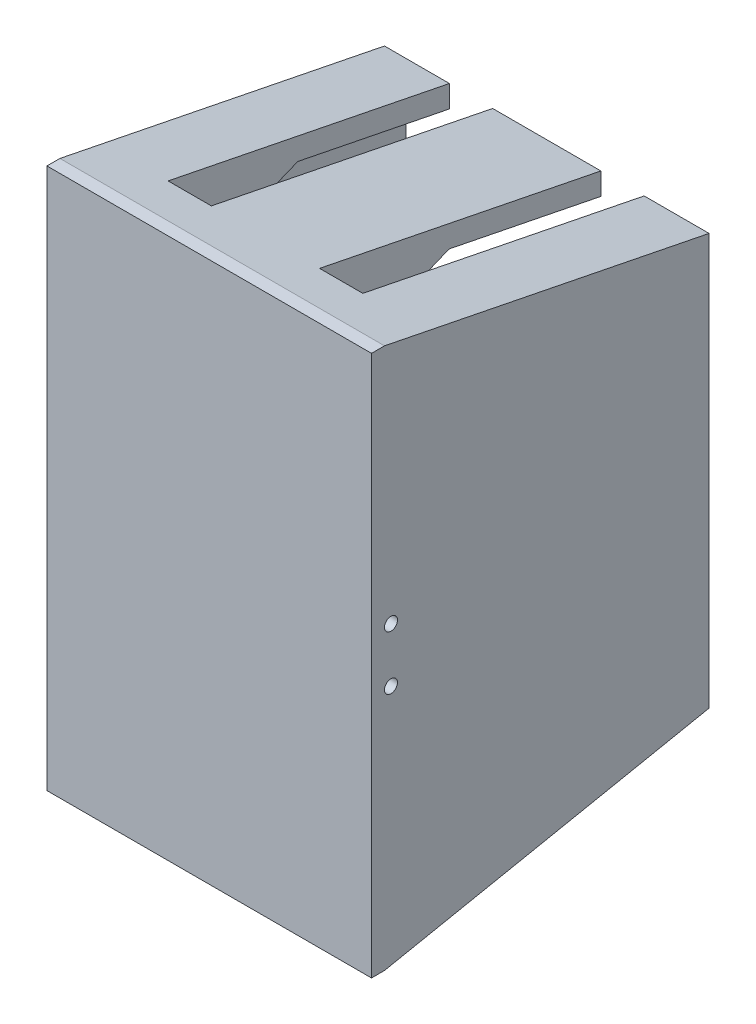
ISO-10303-21;
HEADER;
FILE_DESCRIPTION(('STEP AP214'),'2;1');
FILE_NAME('part.step','',(''),(''),'','','');
FILE_SCHEMA(('AUTOMOTIVE_DESIGN { 1 0 10303 214 1 1 1 1 }'));
ENDSEC;
DATA;
#1=APPLICATION_CONTEXT('core data for automotive mechanical design processes');
#2=APPLICATION_PROTOCOL_DEFINITION('international standard','automotive_design',2000,#1);
#3=PRODUCT_CONTEXT('',#1,'mechanical');
#4=PRODUCT('Part','Part','',(#3));
#5=PRODUCT_RELATED_PRODUCT_CATEGORY('part','',(#4));
#6=PRODUCT_DEFINITION_FORMATION('','',#4);
#7=PRODUCT_DEFINITION_CONTEXT('part definition',#1,'design');
#8=PRODUCT_DEFINITION('design','',#6,#7);
#9=PRODUCT_DEFINITION_SHAPE('','',#8);
#10=(LENGTH_UNIT() NAMED_UNIT(*) SI_UNIT(.MILLI.,.METRE.));
#11=(NAMED_UNIT(*) PLANE_ANGLE_UNIT() SI_UNIT($,.RADIAN.));
#12=(NAMED_UNIT(*) SI_UNIT($,.STERADIAN.) SOLID_ANGLE_UNIT());
#13=UNCERTAINTY_MEASURE_WITH_UNIT(LENGTH_MEASURE(1.E-05),#10,'distance_accuracy_value','');
#14=(GEOMETRIC_REPRESENTATION_CONTEXT(3) GLOBAL_UNCERTAINTY_ASSIGNED_CONTEXT((#13)) GLOBAL_UNIT_ASSIGNED_CONTEXT((#10,
#11,#12)) REPRESENTATION_CONTEXT('',''));
#15=CARTESIAN_POINT('',(0.,0.,0.));
#16=DIRECTION('',(0.,0.,1.));
#17=DIRECTION('',(1.,0.,0.));
#18=AXIS2_PLACEMENT_3D('',#15,#16,#17);
#19=CARTESIAN_POINT('',(37.5,-42.5970966215454,-36.5194193243091));
#20=DIRECTION('',(0.,0.98058067569092,0.196116135138184));
#21=DIRECTION('',(0.,-0.196116135138184,0.98058067569092));
#22=AXIS2_PLACEMENT_3D('',#19,#20,#21);
#23=PLANE('',#22);
#24=DIRECTION('',(0.,0.196116135138184,-0.98058067569092));
#25=VECTOR('',#24,1.);
#26=CARTESIAN_POINT('',(-12.5,-42.5970966215454,-36.5194193243091));
#27=LINE('',#26,#25);
#28=CARTESIAN_POINT('',(-12.5,-49.4009804864072,-2.5));
#29=VERTEX_POINT('',#28);
#30=CARTESIAN_POINT('',(-12.5,-42.4009804864072,-37.5));
#31=VERTEX_POINT('',#30);
#32=EDGE_CURVE('E359',#29,#31,#27,.T.);
#33=ORIENTED_EDGE('',*,*,#32,.F.);
#34=DIRECTION('',(1.,0.,0.));
#35=VECTOR('',#34,1.);
#36=CARTESIAN_POINT('',(-98.8782389027314,-49.4009804864072,-2.5));
#37=LINE('',#36,#35);
#38=CARTESIAN_POINT('',(12.5,-49.4009804864072,-2.5));
#39=VERTEX_POINT('',#38);
#40=EDGE_CURVE('E382',#29,#39,#37,.T.);
#41=ORIENTED_EDGE('',*,*,#40,.T.);
#42=DIRECTION('',(0.,-0.196116135138184,0.98058067569092));
#43=VECTOR('',#42,1.);
#44=CARTESIAN_POINT('',(12.5,-42.5970966215454,-36.5194193243091));
#45=LINE('',#44,#43);
#46=CARTESIAN_POINT('',(12.5,-42.4009804864072,-37.5));
#47=VERTEX_POINT('',#46);
#48=EDGE_CURVE('E333',#47,#39,#45,.T.);
#49=ORIENTED_EDGE('',*,*,#48,.F.);
#50=DIRECTION('',(-1.,0.,0.));
#51=VECTOR('',#50,1.);
#52=CARTESIAN_POINT('',(37.5,-42.4009804864072,-37.5));
#53=LINE('',#52,#51);
#54=EDGE_CURVE('E407',#47,#31,#53,.T.);
#55=ORIENTED_EDGE('',*,*,#54,.T.);
#56=EDGE_LOOP('',(#33,#41,#49,#55));
#57=FACE_BOUND('',#56,.T.);
#58=ADVANCED_FACE('F57',(#57),#23,.T.);
#59=DIRECTION('',(0.,-0.196116135138184,0.98058067569092));
#60=VECTOR('',#59,1.);
#61=CARTESIAN_POINT('',(-22.5,-42.5970966215454,-36.5194193243091));
#62=LINE('',#61,#60);
#63=CARTESIAN_POINT('',(-22.5,-42.4009804864072,-37.5));
#64=VERTEX_POINT('',#63);
#65=CARTESIAN_POINT('',(-22.5,-49.4009804864072,-2.5));
#66=VERTEX_POINT('',#65);
#67=EDGE_CURVE('E343',#64,#66,#62,.T.);
#68=ORIENTED_EDGE('',*,*,#67,.F.);
#69=CARTESIAN_POINT('',(-32.5,-42.4009804864072,-37.5));
#70=VERTEX_POINT('',#69);
#71=EDGE_CURVE('E395',#64,#70,#53,.T.);
#72=ORIENTED_EDGE('',*,*,#71,.T.);
#73=DIRECTION('',(0.,0.196116135138184,-0.98058067569092));
#74=VECTOR('',#73,1.);
#75=CARTESIAN_POINT('',(-32.5,-47.9817120061608,-9.59634240123216));
#76=LINE('',#75,#74);
#77=CARTESIAN_POINT('',(-32.5,-49.4009804864072,-2.50000000000001));
#78=VERTEX_POINT('',#77);
#79=EDGE_CURVE('E385',#78,#70,#76,.T.);
#80=ORIENTED_EDGE('',*,*,#79,.F.);
#81=EDGE_CURVE('E379',#78,#66,#37,.T.);
#82=ORIENTED_EDGE('',*,*,#81,.T.);
#83=EDGE_LOOP('',(#68,#72,#80,#82));
#84=FACE_BOUND('',#83,.T.);
#85=ADVANCED_FACE('F584',(#84),#23,.T.);
#86=CARTESIAN_POINT('',(37.5,-37.5,-37.5));
#87=DIRECTION('',(0.,0.,1.));
#88=DIRECTION('',(0.,-1.,0.));
#89=AXIS2_PLACEMENT_3D('',#86,#87,#88);
#90=PLANE('',#89);
#91=DIRECTION('',(-1.,0.,0.));
#92=VECTOR('',#91,1.);
#93=CARTESIAN_POINT('',(37.5,42.4009804864072,-37.5000000000001));
#94=LINE('',#93,#92);
#95=CARTESIAN_POINT('',(12.5,42.4009804864072,-37.5));
#96=VERTEX_POINT('',#95);
#97=CARTESIAN_POINT('',(-12.5,42.4009804864072,-37.5));
#98=VERTEX_POINT('',#97);
#99=EDGE_CURVE('E400',#96,#98,#94,.T.);
#100=ORIENTED_EDGE('',*,*,#99,.T.);
#101=DIRECTION('',(0.,1.,0.));
#102=VECTOR('',#101,1.);
#103=CARTESIAN_POINT('',(-12.5,-62.5,-37.5));
#104=LINE('',#103,#102);
#105=CARTESIAN_POINT('',(-12.5,47.5,-37.5));
#106=VERTEX_POINT('',#105);
#107=EDGE_CURVE('E301',#98,#106,#104,.T.);
#108=ORIENTED_EDGE('',*,*,#107,.T.);
#109=DIRECTION('',(-1.,0.,0.));
#110=VECTOR('',#109,1.);
#111=CARTESIAN_POINT('',(37.5,47.5,-37.5));
#112=LINE('',#111,#110);
#113=CARTESIAN_POINT('',(12.5,47.5,-37.5));
#114=VERTEX_POINT('',#113);
#115=EDGE_CURVE('E437',#114,#106,#112,.T.);
#116=ORIENTED_EDGE('',*,*,#115,.F.);
#117=DIRECTION('',(0.,1.,0.));
#118=VECTOR('',#117,1.);
#119=CARTESIAN_POINT('',(12.5,-62.5,-37.5));
#120=LINE('',#119,#118);
#121=EDGE_CURVE('E305',#96,#114,#120,.T.);
#122=ORIENTED_EDGE('',*,*,#121,.F.);
#123=EDGE_LOOP('',(#100,#108,#116,#122));
#124=FACE_BOUND('',#123,.T.);
#125=ADVANCED_FACE('F589',(#124),#90,.F.);
#126=DIRECTION('',(-1.,0.,0.));
#127=VECTOR('',#126,1.);
#128=CARTESIAN_POINT('',(37.5,-47.5,-37.5));
#129=LINE('',#128,#127);
#130=CARTESIAN_POINT('',(12.5,-47.5,-37.5));
#131=VERTEX_POINT('',#130);
#132=CARTESIAN_POINT('',(-12.5,-47.5,-37.5));
#133=VERTEX_POINT('',#132);
#134=EDGE_CURVE('E427',#131,#133,#129,.T.);
#135=ORIENTED_EDGE('',*,*,#134,.T.);
#136=EDGE_CURVE('E300',#133,#31,#104,.T.);
#137=ORIENTED_EDGE('',*,*,#136,.T.);
#138=ORIENTED_EDGE('',*,*,#54,.F.);
#139=EDGE_CURVE('E304',#131,#47,#120,.T.);
#140=ORIENTED_EDGE('',*,*,#139,.F.);
#141=EDGE_LOOP('',(#135,#137,#138,#140));
#142=FACE_BOUND('',#141,.T.);
#143=ADVANCED_FACE('F482',(#142),#90,.F.);
#144=CARTESIAN_POINT('',(-22.5,47.5,-37.5));
#145=VERTEX_POINT('',#144);
#146=CARTESIAN_POINT('',(-37.5,47.5,-37.5));
#147=VERTEX_POINT('',#146);
#148=EDGE_CURVE('E432',#145,#147,#112,.T.);
#149=ORIENTED_EDGE('',*,*,#148,.F.);
#150=DIRECTION('',(0.,1.,0.));
#151=VECTOR('',#150,1.);
#152=CARTESIAN_POINT('',(-22.5,-62.5,-37.5));
#153=LINE('',#152,#151);
#154=CARTESIAN_POINT('',(-22.5,42.4009804864072,-37.5));
#155=VERTEX_POINT('',#154);
#156=EDGE_CURVE('E298',#155,#145,#153,.T.);
#157=ORIENTED_EDGE('',*,*,#156,.F.);
#158=CARTESIAN_POINT('',(-32.5,42.4009804864072,-37.5000000000001));
#159=VERTEX_POINT('',#158);
#160=EDGE_CURVE('E401',#155,#159,#94,.T.);
#161=ORIENTED_EDGE('',*,*,#160,.T.);
#162=DIRECTION('',(0.,1.,0.));
#163=VECTOR('',#162,1.);
#164=CARTESIAN_POINT('',(-32.5,0.,-37.5));
#165=LINE('',#164,#163);
#166=EDGE_CURVE('E393',#70,#159,#165,.T.);
#167=ORIENTED_EDGE('',*,*,#166,.F.);
#168=ORIENTED_EDGE('',*,*,#71,.F.);
#169=CARTESIAN_POINT('',(-22.5,-47.5,-37.5));
#170=VERTEX_POINT('',#169);
#171=EDGE_CURVE('E297',#170,#64,#153,.T.);
#172=ORIENTED_EDGE('',*,*,#171,.F.);
#173=CARTESIAN_POINT('',(-37.5,-47.5,-37.5));
#174=VERTEX_POINT('',#173);
#175=EDGE_CURVE('E418',#170,#174,#129,.T.);
#176=ORIENTED_EDGE('',*,*,#175,.T.);
#177=DIRECTION('',(0.,1.,0.));
#178=VECTOR('',#177,1.);
#179=CARTESIAN_POINT('',(-37.5,-37.5,-37.5));
#180=LINE('',#179,#178);
#181=EDGE_CURVE('E413',#174,#147,#180,.T.);
#182=ORIENTED_EDGE('',*,*,#181,.T.);
#183=EDGE_LOOP('',(#149,#157,#161,#167,#168,#172,#176,#182));
#184=FACE_BOUND('',#183,.T.);
#185=ADVANCED_FACE('F489',(#184),#90,.F.);
#186=CARTESIAN_POINT('',(37.5,42.5970966215454,-36.5194193243091));
#187=DIRECTION('',(0.,-0.98058067569092,0.196116135138184));
#188=DIRECTION('',(0.,-0.196116135138184,-0.98058067569092));
#189=AXIS2_PLACEMENT_3D('',#186,#187,#188);
#190=PLANE('',#189);
#191=DIRECTION('',(0.,0.196116135138184,0.98058067569092));
#192=VECTOR('',#191,1.);
#193=CARTESIAN_POINT('',(-12.5,42.5970966215454,-36.5194193243091));
#194=LINE('',#193,#192);
#195=CARTESIAN_POINT('',(-12.5,49.4009804864072,-2.5));
#196=VERTEX_POINT('',#195);
#197=EDGE_CURVE('E357',#98,#196,#194,.T.);
#198=ORIENTED_EDGE('',*,*,#197,.F.);
#199=ORIENTED_EDGE('',*,*,#99,.F.);
#200=DIRECTION('',(0.,-0.196116135138184,-0.98058067569092));
#201=VECTOR('',#200,1.);
#202=CARTESIAN_POINT('',(12.5,42.5970966215454,-36.5194193243091));
#203=LINE('',#202,#201);
#204=CARTESIAN_POINT('',(12.5,49.4009804864072,-2.5));
#205=VERTEX_POINT('',#204);
#206=EDGE_CURVE('E331',#205,#96,#203,.T.);
#207=ORIENTED_EDGE('',*,*,#206,.F.);
#208=DIRECTION('',(1.,0.,0.));
#209=VECTOR('',#208,1.);
#210=CARTESIAN_POINT('',(-98.8782389027314,49.4009804864072,-2.5));
#211=LINE('',#210,#209);
#212=EDGE_CURVE('E372',#196,#205,#211,.T.);
#213=ORIENTED_EDGE('',*,*,#212,.F.);
#214=EDGE_LOOP('',(#198,#199,#207,#213));
#215=FACE_BOUND('',#214,.T.);
#216=ADVANCED_FACE('F600',(#215),#190,.T.);
#217=DIRECTION('',(0.,-0.196116135138184,-0.98058067569092));
#218=VECTOR('',#217,1.);
#219=CARTESIAN_POINT('',(-22.5,42.5970966215454,-36.5194193243091));
#220=LINE('',#219,#218);
#221=CARTESIAN_POINT('',(-22.5,49.4009804864072,-2.5));
#222=VERTEX_POINT('',#221);
#223=EDGE_CURVE('E341',#222,#155,#220,.T.);
#224=ORIENTED_EDGE('',*,*,#223,.F.);
#225=CARTESIAN_POINT('',(-32.5,49.4009804864072,-2.5));
#226=VERTEX_POINT('',#225);
#227=EDGE_CURVE('E368',#226,#222,#211,.T.);
#228=ORIENTED_EDGE('',*,*,#227,.F.);
#229=DIRECTION('',(0.,0.196116135138184,0.98058067569092));
#230=VECTOR('',#229,1.);
#231=CARTESIAN_POINT('',(-32.5,47.9817120061608,-9.59634240123216));
#232=LINE('',#231,#230);
#233=EDGE_CURVE('E378',#159,#226,#232,.T.);
#234=ORIENTED_EDGE('',*,*,#233,.F.);
#235=ORIENTED_EDGE('',*,*,#160,.F.);
#236=EDGE_LOOP('',(#224,#228,#234,#235));
#237=FACE_BOUND('',#236,.T.);
#238=ADVANCED_FACE('F594',(#237),#190,.T.);
#239=DIRECTION('',(0.,0.196116135138184,-0.98058067569092));
#240=VECTOR('',#239,1.);
#241=CARTESIAN_POINT('',(22.5,-42.5970966215454,-36.5194193243091));
#242=LINE('',#241,#240);
#243=CARTESIAN_POINT('',(22.5,-49.4009804864072,-2.5));
#244=VERTEX_POINT('',#243);
#245=CARTESIAN_POINT('',(22.5,-42.4009804864072,-37.5));
#246=VERTEX_POINT('',#245);
#247=EDGE_CURVE('E323',#244,#246,#242,.T.);
#248=ORIENTED_EDGE('',*,*,#247,.F.);
#249=CARTESIAN_POINT('',(32.5,-49.4009804864072,-2.50000000000001));
#250=VERTEX_POINT('',#249);
#251=EDGE_CURVE('E375',#244,#250,#37,.T.);
#252=ORIENTED_EDGE('',*,*,#251,.T.);
#253=DIRECTION('',(0.,0.196116135138184,-0.98058067569092));
#254=VECTOR('',#253,1.);
#255=CARTESIAN_POINT('',(32.5,-47.9817120061608,-9.59634240123216));
#256=LINE('',#255,#254);
#257=CARTESIAN_POINT('',(32.5,-42.4009804864072,-37.5));
#258=VERTEX_POINT('',#257);
#259=EDGE_CURVE('E389',#250,#258,#256,.T.);
#260=ORIENTED_EDGE('',*,*,#259,.T.);
#261=EDGE_CURVE('E404',#258,#246,#53,.T.);
#262=ORIENTED_EDGE('',*,*,#261,.T.);
#263=EDGE_LOOP('',(#248,#252,#260,#262));
#264=FACE_BOUND('',#263,.T.);
#265=ADVANCED_FACE('F561',(#264),#23,.T.);
#266=CARTESIAN_POINT('',(32.5,0.,0.));
#267=DIRECTION('',(-1.,0.,0.));
#268=DIRECTION('',(0.,0.,1.));
#269=AXIS2_PLACEMENT_3D('',#266,#267,#268);
#270=PLANE('',#269);
#271=CARTESIAN_POINT('',(32.5,0.,-19.8636696145484));
#272=DIRECTION('',(-1.,0.,0.));
#273=DIRECTION('',(0.,0.,1.));
#274=AXIS2_PLACEMENT_3D('',#271,#272,#273);
#275=CIRCLE('',#274,52.3636696145484);
#276=CARTESIAN_POINT('',(32.5,49.4009804864072,-2.5));
#277=VERTEX_POINT('',#276);
#278=EDGE_CURVE('E371',#277,#250,#275,.F.);
#279=ORIENTED_EDGE('',*,*,#278,.F.);
#280=DIRECTION('',(0.,0.196116135138184,0.98058067569092));
#281=VECTOR('',#280,1.);
#282=CARTESIAN_POINT('',(32.5,47.9817120061608,-9.59634240123216));
#283=LINE('',#282,#281);
#284=CARTESIAN_POINT('',(32.5,42.4009804864072,-37.5000000000001));
#285=VERTEX_POINT('',#284);
#286=EDGE_CURVE('E386',#285,#277,#283,.T.);
#287=ORIENTED_EDGE('',*,*,#286,.F.);
#288=DIRECTION('',(0.,1.,0.));
#289=VECTOR('',#288,1.);
#290=CARTESIAN_POINT('',(32.5,0.,-37.5));
#291=LINE('',#290,#289);
#292=EDGE_CURVE('E390',#258,#285,#291,.T.);
#293=ORIENTED_EDGE('',*,*,#292,.F.);
#294=ORIENTED_EDGE('',*,*,#259,.F.);
#295=EDGE_LOOP('',(#279,#287,#293,#294));
#296=FACE_BOUND('',#295,.T.);
#297=ADVANCED_FACE('F554',(#296),#270,.T.);
#298=CARTESIAN_POINT('',(-32.5,0.,0.));
#299=DIRECTION('',(-1.,0.,0.));
#300=DIRECTION('',(0.,0.,1.));
#301=AXIS2_PLACEMENT_3D('',#298,#299,#300);
#302=PLANE('',#301);
#303=ORIENTED_EDGE('',*,*,#233,.T.);
#304=CARTESIAN_POINT('',(-32.5,0.,-19.8636696145484));
#305=DIRECTION('',(-1.,0.,0.));
#306=DIRECTION('',(0.,0.,1.));
#307=AXIS2_PLACEMENT_3D('',#304,#305,#306);
#308=CIRCLE('',#307,52.3636696145484);
#309=EDGE_CURVE('E376',#226,#78,#308,.F.);
#310=ORIENTED_EDGE('',*,*,#309,.T.);
#311=ORIENTED_EDGE('',*,*,#79,.T.);
#312=ORIENTED_EDGE('',*,*,#166,.T.);
#313=EDGE_LOOP('',(#303,#310,#311,#312));
#314=FACE_BOUND('',#313,.T.);
#315=ADVANCED_FACE('F599',(#314),#302,.F.);
#316=CARTESIAN_POINT('',(37.5,-47.5,-37.5));
#317=VERTEX_POINT('',#316);
#318=CARTESIAN_POINT('',(22.5,-47.5,-37.5));
#319=VERTEX_POINT('',#318);
#320=EDGE_CURVE('E423',#317,#319,#129,.T.);
#321=ORIENTED_EDGE('',*,*,#320,.T.);
#322=DIRECTION('',(0.,1.,0.));
#323=VECTOR('',#322,1.);
#324=CARTESIAN_POINT('',(22.5,-62.5,-37.5));
#325=LINE('',#324,#323);
#326=EDGE_CURVE('E307',#319,#246,#325,.T.);
#327=ORIENTED_EDGE('',*,*,#326,.T.);
#328=ORIENTED_EDGE('',*,*,#261,.F.);
#329=ORIENTED_EDGE('',*,*,#292,.T.);
#330=CARTESIAN_POINT('',(22.5,42.4009804864072,-37.5));
#331=VERTEX_POINT('',#330);
#332=EDGE_CURVE('E396',#285,#331,#94,.T.);
#333=ORIENTED_EDGE('',*,*,#332,.T.);
#334=CARTESIAN_POINT('',(22.5,47.5,-37.5));
#335=VERTEX_POINT('',#334);
#336=EDGE_CURVE('E308',#331,#335,#325,.T.);
#337=ORIENTED_EDGE('',*,*,#336,.T.);
#338=CARTESIAN_POINT('',(37.5,47.5,-37.5));
#339=VERTEX_POINT('',#338);
#340=EDGE_CURVE('E433',#339,#335,#112,.T.);
#341=ORIENTED_EDGE('',*,*,#340,.F.);
#342=DIRECTION('',(0.,1.,0.));
#343=VECTOR('',#342,1.);
#344=CARTESIAN_POINT('',(37.5,-32.5,-37.5));
#345=LINE('',#344,#343);
#346=EDGE_CURVE('E410',#317,#339,#345,.T.);
#347=ORIENTED_EDGE('',*,*,#346,.F.);
#348=EDGE_LOOP('',(#321,#327,#328,#329,#333,#337,#341,#347));
#349=FACE_BOUND('',#348,.T.);
#350=ADVANCED_FACE('F534',(#349),#90,.F.);
#351=CARTESIAN_POINT('',(37.5,47.5,-37.5));
#352=DIRECTION('',(0.,-0.98058067569092,0.196116135138184));
#353=DIRECTION('',(0.,-0.196116135138184,-0.98058067569092));
#354=AXIS2_PLACEMENT_3D('',#351,#352,#353);
#355=PLANE('',#354);
#356=ORIENTED_EDGE('',*,*,#115,.T.);
#357=DIRECTION('',(0.,0.196116135138184,0.98058067569092));
#358=VECTOR('',#357,1.);
#359=CARTESIAN_POINT('',(-12.5,47.5,-37.5));
#360=LINE('',#359,#358);
#361=CARTESIAN_POINT('',(-12.5,60.5,27.5));
#362=VERTEX_POINT('',#361);
#363=EDGE_CURVE('E364',#106,#362,#360,.T.);
#364=ORIENTED_EDGE('',*,*,#363,.T.);
#365=DIRECTION('',(-1.,0.,0.));
#366=VECTOR('',#365,1.);
#367=CARTESIAN_POINT('',(37.5,60.5,27.5));
#368=LINE('',#367,#366);
#369=CARTESIAN_POINT('',(-22.5,60.5,27.5));
#370=VERTEX_POINT('',#369);
#371=EDGE_CURVE('E354',#362,#370,#368,.T.);
#372=ORIENTED_EDGE('',*,*,#371,.T.);
#373=DIRECTION('',(0.,-0.196116135138184,-0.98058067569092));
#374=VECTOR('',#373,1.);
#375=CARTESIAN_POINT('',(-22.5,47.5,-37.5));
#376=LINE('',#375,#374);
#377=EDGE_CURVE('E348',#370,#145,#376,.T.);
#378=ORIENTED_EDGE('',*,*,#377,.T.);
#379=ORIENTED_EDGE('',*,*,#148,.T.);
#380=DIRECTION('',(0.,0.196116135138184,0.98058067569092));
#381=VECTOR('',#380,1.);
#382=CARTESIAN_POINT('',(-37.5,47.5,-37.5));
#383=LINE('',#382,#381);
#384=CARTESIAN_POINT('',(-37.5,62.5,37.5));
#385=VERTEX_POINT('',#384);
#386=EDGE_CURVE('E399',#147,#385,#383,.T.);
#387=ORIENTED_EDGE('',*,*,#386,.T.);
#388=DIRECTION('',(-1.,0.,0.));
#389=VECTOR('',#388,1.);
#390=CARTESIAN_POINT('',(37.5,62.5,37.5));
#391=LINE('',#390,#389);
#392=CARTESIAN_POINT('',(37.5,62.5,37.5));
#393=VERTEX_POINT('',#392);
#394=EDGE_CURVE('E429',#393,#385,#391,.T.);
#395=ORIENTED_EDGE('',*,*,#394,.F.);
#396=DIRECTION('',(0.,0.196116135138184,0.98058067569092));
#397=VECTOR('',#396,1.);
#398=CARTESIAN_POINT('',(37.5,47.5,-37.5));
#399=LINE('',#398,#397);
#400=EDGE_CURVE('E412',#339,#393,#399,.T.);
#401=ORIENTED_EDGE('',*,*,#400,.F.);
#402=ORIENTED_EDGE('',*,*,#340,.T.);
#403=DIRECTION('',(0.,0.196116135138184,0.98058067569092));
#404=VECTOR('',#403,1.);
#405=CARTESIAN_POINT('',(22.5,47.5,-37.5));
#406=LINE('',#405,#404);
#407=CARTESIAN_POINT('',(22.5,60.5,27.5));
#408=VERTEX_POINT('',#407);
#409=EDGE_CURVE('E328',#335,#408,#406,.T.);
#410=ORIENTED_EDGE('',*,*,#409,.T.);
#411=DIRECTION('',(-1.,0.,0.));
#412=VECTOR('',#411,1.);
#413=CARTESIAN_POINT('',(37.5,60.5,27.5));
#414=LINE('',#413,#412);
#415=CARTESIAN_POINT('',(12.5,60.5,27.5));
#416=VERTEX_POINT('',#415);
#417=EDGE_CURVE('E318',#408,#416,#414,.T.);
#418=ORIENTED_EDGE('',*,*,#417,.T.);
#419=DIRECTION('',(0.,-0.196116135138184,-0.98058067569092));
#420=VECTOR('',#419,1.);
#421=CARTESIAN_POINT('',(12.5,47.5,-37.5));
#422=LINE('',#421,#420);
#423=EDGE_CURVE('E338',#416,#114,#422,.T.);
#424=ORIENTED_EDGE('',*,*,#423,.T.);
#425=EDGE_LOOP('',(#356,#364,#372,#378,#379,#387,#395,#401,#402,#410,#418,#424));
#426=FACE_BOUND('',#425,.T.);
#427=ADVANCED_FACE('F59',(#426),#355,.F.);
#428=CARTESIAN_POINT('',(37.5,-47.5,-37.5));
#429=DIRECTION('',(0.,0.98058067569092,0.196116135138184));
#430=DIRECTION('',(0.,-0.196116135138184,0.98058067569092));
#431=AXIS2_PLACEMENT_3D('',#428,#429,#430);
#432=PLANE('',#431);
#433=DIRECTION('',(1.,0.,0.));
#434=VECTOR('',#433,1.);
#435=CARTESIAN_POINT('',(37.5,-60.5,27.5));
#436=LINE('',#435,#434);
#437=CARTESIAN_POINT('',(-22.5,-60.5,27.5));
#438=VERTEX_POINT('',#437);
#439=CARTESIAN_POINT('',(-12.5,-60.5,27.5));
#440=VERTEX_POINT('',#439);
#441=EDGE_CURVE('E351',#438,#440,#436,.T.);
#442=ORIENTED_EDGE('',*,*,#441,.T.);
#443=DIRECTION('',(0.,0.196116135138184,-0.98058067569092));
#444=VECTOR('',#443,1.);
#445=CARTESIAN_POINT('',(-12.5,-47.5,-37.5));
#446=LINE('',#445,#444);
#447=EDGE_CURVE('E361',#440,#133,#446,.T.);
#448=ORIENTED_EDGE('',*,*,#447,.T.);
#449=ORIENTED_EDGE('',*,*,#134,.F.);
#450=DIRECTION('',(0.,-0.196116135138184,0.98058067569092));
#451=VECTOR('',#450,1.);
#452=CARTESIAN_POINT('',(12.5,-47.5,-37.5));
#453=LINE('',#452,#451);
#454=CARTESIAN_POINT('',(12.5,-60.5,27.5));
#455=VERTEX_POINT('',#454);
#456=EDGE_CURVE('E335',#131,#455,#453,.T.);
#457=ORIENTED_EDGE('',*,*,#456,.T.);
#458=DIRECTION('',(1.,0.,0.));
#459=VECTOR('',#458,1.);
#460=CARTESIAN_POINT('',(37.5,-60.5,27.5));
#461=LINE('',#460,#459);
#462=CARTESIAN_POINT('',(22.5,-60.5,27.5));
#463=VERTEX_POINT('',#462);
#464=EDGE_CURVE('E315',#455,#463,#461,.T.);
#465=ORIENTED_EDGE('',*,*,#464,.T.);
#466=DIRECTION('',(0.,0.196116135138184,-0.98058067569092));
#467=VECTOR('',#466,1.);
#468=CARTESIAN_POINT('',(22.5,-47.5,-37.5));
#469=LINE('',#468,#467);
#470=EDGE_CURVE('E325',#463,#319,#469,.T.);
#471=ORIENTED_EDGE('',*,*,#470,.T.);
#472=ORIENTED_EDGE('',*,*,#320,.F.);
#473=DIRECTION('',(0.,0.196116135138184,-0.98058067569092));
#474=VECTOR('',#473,1.);
#475=CARTESIAN_POINT('',(37.5,-47.5,-37.5));
#476=LINE('',#475,#474);
#477=CARTESIAN_POINT('',(37.5,-62.5,37.5));
#478=VERTEX_POINT('',#477);
#479=EDGE_CURVE('E415',#478,#317,#476,.T.);
#480=ORIENTED_EDGE('',*,*,#479,.F.);
#481=DIRECTION('',(-1.,0.,0.));
#482=VECTOR('',#481,1.);
#483=CARTESIAN_POINT('',(37.5,-62.5,37.5));
#484=LINE('',#483,#482);
#485=CARTESIAN_POINT('',(-37.5,-62.5,37.5));
#486=VERTEX_POINT('',#485);
#487=EDGE_CURVE('E426',#478,#486,#484,.T.);
#488=ORIENTED_EDGE('',*,*,#487,.T.);
#489=DIRECTION('',(0.,0.196116135138184,-0.98058067569092));
#490=VECTOR('',#489,1.);
#491=CARTESIAN_POINT('',(-37.5,-47.5,-37.5));
#492=LINE('',#491,#490);
#493=EDGE_CURVE('E282',#486,#174,#492,.T.);
#494=ORIENTED_EDGE('',*,*,#493,.T.);
#495=ORIENTED_EDGE('',*,*,#175,.F.);
#496=DIRECTION('',(0.,-0.196116135138184,0.98058067569092));
#497=VECTOR('',#496,1.);
#498=CARTESIAN_POINT('',(-22.5,-47.5,-37.5));
#499=LINE('',#498,#497);
#500=EDGE_CURVE('E345',#170,#438,#499,.T.);
#501=ORIENTED_EDGE('',*,*,#500,.T.);
#502=EDGE_LOOP('',(#442,#448,#449,#457,#465,#471,#472,#480,#488,#494,#495,#501));
#503=FACE_BOUND('',#502,.T.);
#504=ADVANCED_FACE('F479',(#503),#432,.F.);
#505=CARTESIAN_POINT('',(37.5,0.,0.));
#506=DIRECTION('',(-1.,0.,0.));
#507=DIRECTION('',(0.,0.,1.));
#508=AXIS2_PLACEMENT_3D('',#505,#506,#507);
#509=PLANE('',#508);
#510=CARTESIAN_POINT('',(37.5,6.15,36.));
#511=DIRECTION('',(1.,0.,0.));
#512=DIRECTION('',(0.,0.,-1.));
#513=AXIS2_PLACEMENT_3D('',#510,#511,#512);
#514=CIRCLE('',#513,1.5);
#515=CARTESIAN_POINT('',(37.5,6.15,34.5));
#516=VERTEX_POINT('',#515);
#517=EDGE_CURVE('E511',#516,#516,#514,.T.);
#518=ORIENTED_EDGE('',*,*,#517,.F.);
#519=EDGE_LOOP('',(#518));
#520=FACE_BOUND('',#519,.T.);
#521=CARTESIAN_POINT('',(37.5,-6.35,36.));
#522=DIRECTION('',(1.,0.,0.));
#523=DIRECTION('',(0.,0.,1.));
#524=AXIS2_PLACEMENT_3D('',#521,#522,#523);
#525=CIRCLE('',#524,1.5);
#526=CARTESIAN_POINT('',(37.5,-6.35,37.5));
#527=VERTEX_POINT('',#526);
#528=EDGE_CURVE('E505',#527,#527,#525,.T.);
#529=ORIENTED_EDGE('',*,*,#528,.F.);
#530=EDGE_LOOP('',(#529));
#531=FACE_BOUND('',#530,.T.);
#532=ORIENTED_EDGE('',*,*,#346,.T.);
#533=ORIENTED_EDGE('',*,*,#400,.T.);
#534=DIRECTION('',(0.,0.,-1.));
#535=VECTOR('',#534,1.);
#536=CARTESIAN_POINT('',(37.5,62.5,40.5));
#537=LINE('',#536,#535);
#538=CARTESIAN_POINT('',(37.5,62.5,40.5));
#539=VERTEX_POINT('',#538);
#540=EDGE_CURVE('E287',#539,#393,#537,.T.);
#541=ORIENTED_EDGE('',*,*,#540,.F.);
#542=DIRECTION('',(0.,1.,0.));
#543=VECTOR('',#542,1.);
#544=CARTESIAN_POINT('',(37.5,62.5,40.5));
#545=LINE('',#544,#543);
#546=CARTESIAN_POINT('',(37.5,-62.5,40.5));
#547=VERTEX_POINT('',#546);
#548=EDGE_CURVE('E265',#547,#539,#545,.T.);
#549=ORIENTED_EDGE('',*,*,#548,.F.);
#550=DIRECTION('',(0.,0.,-1.));
#551=VECTOR('',#550,1.);
#552=CARTESIAN_POINT('',(37.5,-62.5,40.5));
#553=LINE('',#552,#551);
#554=EDGE_CURVE('E262',#547,#478,#553,.T.);
#555=ORIENTED_EDGE('',*,*,#554,.T.);
#556=ORIENTED_EDGE('',*,*,#479,.T.);
#557=EDGE_LOOP('',(#532,#533,#541,#549,#555,#556));
#558=FACE_BOUND('',#557,.T.);
#559=ADVANCED_FACE('F526',(#520,#531,#558),#509,.F.);
#560=CARTESIAN_POINT('',(-37.5,0.,0.));
#561=DIRECTION('',(-1.,0.,0.));
#562=DIRECTION('',(0.,0.,1.));
#563=AXIS2_PLACEMENT_3D('',#560,#561,#562);
#564=PLANE('',#563);
#565=CARTESIAN_POINT('',(-37.5,6.15,36.));
#566=DIRECTION('',(1.,0.,0.));
#567=DIRECTION('',(0.,0.,-1.));
#568=AXIS2_PLACEMENT_3D('',#565,#566,#567);
#569=CIRCLE('',#568,1.5);
#570=CARTESIAN_POINT('',(-37.5,6.15,34.5));
#571=VERTEX_POINT('',#570);
#572=EDGE_CURVE('E275',#571,#571,#569,.T.);
#573=ORIENTED_EDGE('',*,*,#572,.T.);
#574=EDGE_LOOP('',(#573));
#575=FACE_BOUND('',#574,.T.);
#576=CARTESIAN_POINT('',(-37.5,-6.35,36.));
#577=DIRECTION('',(1.,0.,0.));
#578=DIRECTION('',(0.,0.,1.));
#579=AXIS2_PLACEMENT_3D('',#576,#577,#578);
#580=CIRCLE('',#579,1.5);
#581=CARTESIAN_POINT('',(-37.5,-6.35,37.5));
#582=VERTEX_POINT('',#581);
#583=EDGE_CURVE('E508',#582,#582,#580,.T.);
#584=ORIENTED_EDGE('',*,*,#583,.T.);
#585=EDGE_LOOP('',(#584));
#586=FACE_BOUND('',#585,.T.);
#587=ORIENTED_EDGE('',*,*,#386,.F.);
#588=ORIENTED_EDGE('',*,*,#181,.F.);
#589=ORIENTED_EDGE('',*,*,#493,.F.);
#590=DIRECTION('',(0.,0.,-1.));
#591=VECTOR('',#590,1.);
#592=CARTESIAN_POINT('',(-37.5,-62.5,40.5));
#593=LINE('',#592,#591);
#594=CARTESIAN_POINT('',(-37.5,-62.5,40.5));
#595=VERTEX_POINT('',#594);
#596=EDGE_CURVE('E260',#595,#486,#593,.T.);
#597=ORIENTED_EDGE('',*,*,#596,.F.);
#598=DIRECTION('',(0.,-1.,0.));
#599=VECTOR('',#598,1.);
#600=CARTESIAN_POINT('',(-37.5,62.5,40.5));
#601=LINE('',#600,#599);
#602=CARTESIAN_POINT('',(-37.5,62.5,40.5));
#603=VERTEX_POINT('',#602);
#604=EDGE_CURVE('E266',#603,#595,#601,.T.);
#605=ORIENTED_EDGE('',*,*,#604,.F.);
#606=DIRECTION('',(0.,0.,-1.));
#607=VECTOR('',#606,1.);
#608=CARTESIAN_POINT('',(-37.5,62.5,40.5));
#609=LINE('',#608,#607);
#610=EDGE_CURVE('E491',#603,#385,#609,.T.);
#611=ORIENTED_EDGE('',*,*,#610,.T.);
#612=EDGE_LOOP('',(#587,#588,#589,#597,#605,#611));
#613=FACE_BOUND('',#612,.T.);
#614=ADVANCED_FACE('F279',(#575,#586,#613),#564,.T.);
#615=DIRECTION('',(0.,0.196116135138184,0.98058067569092));
#616=VECTOR('',#615,1.);
#617=CARTESIAN_POINT('',(22.5,42.5970966215454,-36.5194193243091));
#618=LINE('',#617,#616);
#619=CARTESIAN_POINT('',(22.5,49.4009804864072,-2.5));
#620=VERTEX_POINT('',#619);
#621=EDGE_CURVE('E321',#331,#620,#618,.T.);
#622=ORIENTED_EDGE('',*,*,#621,.F.);
#623=ORIENTED_EDGE('',*,*,#332,.F.);
#624=ORIENTED_EDGE('',*,*,#286,.T.);
#625=EDGE_CURVE('E367',#620,#277,#211,.T.);
#626=ORIENTED_EDGE('',*,*,#625,.F.);
#627=EDGE_LOOP('',(#622,#623,#624,#626));
#628=FACE_BOUND('',#627,.T.);
#629=ADVANCED_FACE('F556',(#628),#190,.T.);
#630=CARTESIAN_POINT('',(-98.8782389027314,0.,-19.8636696145484));
#631=DIRECTION('',(1.,0.,0.));
#632=DIRECTION('',(0.,0.,-1.));
#633=AXIS2_PLACEMENT_3D('',#630,#631,#632);
#634=CYLINDRICAL_SURFACE('',#633,52.3636696145484);
#635=ORIENTED_EDGE('',*,*,#40,.F.);
#636=CARTESIAN_POINT('',(-12.5,0.,-19.8636696145484));
#637=DIRECTION('',(1.,0.,0.));
#638=DIRECTION('',(0.,0.,-1.));
#639=AXIS2_PLACEMENT_3D('',#636,#637,#638);
#640=CIRCLE('',#639,52.3636696145484);
#641=CARTESIAN_POINT('',(-12.5,-22.3301745659429,27.5));
#642=VERTEX_POINT('',#641);
#643=EDGE_CURVE('E12',#29,#642,#640,.F.);
#644=ORIENTED_EDGE('',*,*,#643,.T.);
#645=DIRECTION('',(1.,0.,0.));
#646=VECTOR('',#645,1.);
#647=CARTESIAN_POINT('',(-98.8782389027314,-22.3301745659429,27.5));
#648=LINE('',#647,#646);
#649=CARTESIAN_POINT('',(-22.5,-22.3301745659429,27.5));
#650=VERTEX_POINT('',#649);
#651=EDGE_CURVE('E61',#642,#650,#648,.F.);
#652=ORIENTED_EDGE('',*,*,#651,.T.);
#653=CARTESIAN_POINT('',(-22.5,0.,-19.8636696145484));
#654=DIRECTION('',(-1.,0.,0.));
#655=DIRECTION('',(0.,0.,1.));
#656=AXIS2_PLACEMENT_3D('',#653,#654,#655);
#657=CIRCLE('',#656,52.3636696145484);
#658=EDGE_CURVE('E455',#650,#66,#657,.F.);
#659=ORIENTED_EDGE('',*,*,#658,.T.);
#660=ORIENTED_EDGE('',*,*,#81,.F.);
#661=ORIENTED_EDGE('',*,*,#309,.F.);
#662=ORIENTED_EDGE('',*,*,#227,.T.);
#663=CARTESIAN_POINT('',(-22.5,22.3301745659429,27.5));
#664=VERTEX_POINT('',#663);
#665=EDGE_CURVE('E451',#222,#664,#657,.F.);
#666=ORIENTED_EDGE('',*,*,#665,.T.);
#667=DIRECTION('',(1.,0.,0.));
#668=VECTOR('',#667,1.);
#669=CARTESIAN_POINT('',(-98.8782389027314,22.3301745659429,27.5));
#670=LINE('',#669,#668);
#671=CARTESIAN_POINT('',(-12.5,22.3301745659429,27.5));
#672=VERTEX_POINT('',#671);
#673=EDGE_CURVE('E454',#664,#672,#670,.T.);
#674=ORIENTED_EDGE('',*,*,#673,.T.);
#675=EDGE_CURVE('E66',#672,#196,#640,.F.);
#676=ORIENTED_EDGE('',*,*,#675,.T.);
#677=ORIENTED_EDGE('',*,*,#212,.T.);
#678=CARTESIAN_POINT('',(12.5,0.,-19.8636696145484));
#679=DIRECTION('',(-1.,0.,0.));
#680=DIRECTION('',(0.,0.,1.));
#681=AXIS2_PLACEMENT_3D('',#678,#679,#680);
#682=CIRCLE('',#681,52.3636696145484);
#683=CARTESIAN_POINT('',(12.5,22.3301745659429,27.5));
#684=VERTEX_POINT('',#683);
#685=EDGE_CURVE('E443',#205,#684,#682,.F.);
#686=ORIENTED_EDGE('',*,*,#685,.T.);
#687=DIRECTION('',(1.,0.,0.));
#688=VECTOR('',#687,1.);
#689=CARTESIAN_POINT('',(-98.8782389027314,22.3301745659429,27.5));
#690=LINE('',#689,#688);
#691=CARTESIAN_POINT('',(22.5,22.3301745659429,27.5));
#692=VERTEX_POINT('',#691);
#693=EDGE_CURVE('E436',#684,#692,#690,.T.);
#694=ORIENTED_EDGE('',*,*,#693,.T.);
#695=CARTESIAN_POINT('',(22.5,0.,-19.8636696145484));
#696=DIRECTION('',(1.,0.,0.));
#697=DIRECTION('',(0.,0.,-1.));
#698=AXIS2_PLACEMENT_3D('',#695,#696,#697);
#699=CIRCLE('',#698,52.3636696145484);
#700=EDGE_CURVE('E440',#692,#620,#699,.F.);
#701=ORIENTED_EDGE('',*,*,#700,.T.);
#702=ORIENTED_EDGE('',*,*,#625,.T.);
#703=ORIENTED_EDGE('',*,*,#278,.T.);
#704=ORIENTED_EDGE('',*,*,#251,.F.);
#705=CARTESIAN_POINT('',(22.5,-22.3301745659429,27.5));
#706=VERTEX_POINT('',#705);
#707=EDGE_CURVE('E444',#244,#706,#699,.F.);
#708=ORIENTED_EDGE('',*,*,#707,.T.);
#709=DIRECTION('',(1.,0.,0.));
#710=VECTOR('',#709,1.);
#711=CARTESIAN_POINT('',(-98.8782389027314,-22.3301745659429,27.5));
#712=LINE('',#711,#710);
#713=CARTESIAN_POINT('',(12.5,-22.3301745659429,27.5));
#714=VERTEX_POINT('',#713);
#715=EDGE_CURVE('E447',#706,#714,#712,.F.);
#716=ORIENTED_EDGE('',*,*,#715,.T.);
#717=EDGE_CURVE('E448',#714,#39,#682,.F.);
#718=ORIENTED_EDGE('',*,*,#717,.T.);
#719=EDGE_LOOP('',(#635,#644,#652,#659,#660,#661,#662,#666,#674,#676,#677,#686,#694,#701,#702,
#703,#704,#708,#716,#718));
#720=FACE_BOUND('',#719,.T.);
#721=ADVANCED_FACE('F465',(#720),#634,.F.);
#722=CARTESIAN_POINT('',(12.5,-62.5,27.5));
#723=DIRECTION('',(0.,0.,1.));
#724=DIRECTION('',(1.,0.,0.));
#725=AXIS2_PLACEMENT_3D('',#722,#723,#724);
#726=PLANE('',#725);
#727=DIRECTION('',(0.,1.,0.));
#728=VECTOR('',#727,1.);
#729=CARTESIAN_POINT('',(22.5,-62.5,27.5));
#730=LINE('',#729,#728);
#731=EDGE_CURVE('E312',#692,#408,#730,.T.);
#732=ORIENTED_EDGE('',*,*,#731,.F.);
#733=ORIENTED_EDGE('',*,*,#693,.F.);
#734=DIRECTION('',(0.,1.,0.));
#735=VECTOR('',#734,1.);
#736=CARTESIAN_POINT('',(12.5,-62.5,27.5));
#737=LINE('',#736,#735);
#738=EDGE_CURVE('E283',#684,#416,#737,.T.);
#739=ORIENTED_EDGE('',*,*,#738,.T.);
#740=ORIENTED_EDGE('',*,*,#417,.F.);
#741=EDGE_LOOP('',(#732,#733,#739,#740));
#742=FACE_BOUND('',#741,.T.);
#743=ADVANCED_FACE('F540',(#742),#726,.F.);
#744=CARTESIAN_POINT('',(22.5,-62.5,27.5));
#745=DIRECTION('',(1.,0.,0.));
#746=DIRECTION('',(0.,0.,-1.));
#747=AXIS2_PLACEMENT_3D('',#744,#745,#746);
#748=PLANE('',#747);
#749=ORIENTED_EDGE('',*,*,#336,.F.);
#750=ORIENTED_EDGE('',*,*,#621,.T.);
#751=ORIENTED_EDGE('',*,*,#700,.F.);
#752=ORIENTED_EDGE('',*,*,#731,.T.);
#753=ORIENTED_EDGE('',*,*,#409,.F.);
#754=EDGE_LOOP('',(#749,#750,#751,#752,#753));
#755=FACE_BOUND('',#754,.T.);
#756=ADVANCED_FACE('F536',(#755),#748,.F.);
#757=CARTESIAN_POINT('',(12.5,-62.5,-37.5));
#758=DIRECTION('',(-1.,0.,0.));
#759=DIRECTION('',(0.,0.,1.));
#760=AXIS2_PLACEMENT_3D('',#757,#758,#759);
#761=PLANE('',#760);
#762=ORIENTED_EDGE('',*,*,#738,.F.);
#763=ORIENTED_EDGE('',*,*,#685,.F.);
#764=ORIENTED_EDGE('',*,*,#206,.T.);
#765=ORIENTED_EDGE('',*,*,#121,.T.);
#766=ORIENTED_EDGE('',*,*,#423,.F.);
#767=EDGE_LOOP('',(#762,#763,#764,#765,#766));
#768=FACE_BOUND('',#767,.T.);
#769=ADVANCED_FACE('F543',(#768),#761,.F.);
#770=ORIENTED_EDGE('',*,*,#139,.T.);
#771=ORIENTED_EDGE('',*,*,#48,.T.);
#772=ORIENTED_EDGE('',*,*,#717,.F.);
#773=EDGE_CURVE('E81',#455,#714,#737,.T.);
#774=ORIENTED_EDGE('',*,*,#773,.F.);
#775=ORIENTED_EDGE('',*,*,#456,.F.);
#776=EDGE_LOOP('',(#770,#771,#772,#774,#775));
#777=FACE_BOUND('',#776,.T.);
#778=ADVANCED_FACE('F573',(#777),#761,.F.);
#779=EDGE_CURVE('E311',#463,#706,#730,.T.);
#780=ORIENTED_EDGE('',*,*,#779,.T.);
#781=ORIENTED_EDGE('',*,*,#707,.F.);
#782=ORIENTED_EDGE('',*,*,#247,.T.);
#783=ORIENTED_EDGE('',*,*,#326,.F.);
#784=ORIENTED_EDGE('',*,*,#470,.F.);
#785=EDGE_LOOP('',(#780,#781,#782,#783,#784));
#786=FACE_BOUND('',#785,.T.);
#787=ADVANCED_FACE('F570',(#786),#748,.F.);
#788=ORIENTED_EDGE('',*,*,#773,.T.);
#789=ORIENTED_EDGE('',*,*,#715,.F.);
#790=ORIENTED_EDGE('',*,*,#779,.F.);
#791=ORIENTED_EDGE('',*,*,#464,.F.);
#792=EDGE_LOOP('',(#788,#789,#790,#791));
#793=FACE_BOUND('',#792,.T.);
#794=ADVANCED_FACE('F572',(#793),#726,.F.);
#795=CARTESIAN_POINT('',(-22.5,-62.5,27.5));
#796=DIRECTION('',(-1.,0.,0.));
#797=DIRECTION('',(0.,0.,1.));
#798=AXIS2_PLACEMENT_3D('',#795,#796,#797);
#799=PLANE('',#798);
#800=DIRECTION('',(0.,1.,0.));
#801=VECTOR('',#800,1.);
#802=CARTESIAN_POINT('',(-22.5,-62.5,27.5));
#803=LINE('',#802,#801);
#804=EDGE_CURVE('E73',#664,#370,#803,.T.);
#805=ORIENTED_EDGE('',*,*,#804,.F.);
#806=ORIENTED_EDGE('',*,*,#665,.F.);
#807=ORIENTED_EDGE('',*,*,#223,.T.);
#808=ORIENTED_EDGE('',*,*,#156,.T.);
#809=ORIENTED_EDGE('',*,*,#377,.F.);
#810=EDGE_LOOP('',(#805,#806,#807,#808,#809));
#811=FACE_BOUND('',#810,.T.);
#812=ADVANCED_FACE('F756',(#811),#799,.F.);
#813=CARTESIAN_POINT('',(-12.5,-62.5,27.5));
#814=DIRECTION('',(0.,0.,1.));
#815=DIRECTION('',(1.,0.,0.));
#816=AXIS2_PLACEMENT_3D('',#813,#814,#815);
#817=PLANE('',#816);
#818=DIRECTION('',(0.,1.,0.));
#819=VECTOR('',#818,1.);
#820=CARTESIAN_POINT('',(-12.5,-62.5,27.5));
#821=LINE('',#820,#819);
#822=EDGE_CURVE('E291',#672,#362,#821,.T.);
#823=ORIENTED_EDGE('',*,*,#822,.F.);
#824=ORIENTED_EDGE('',*,*,#673,.F.);
#825=ORIENTED_EDGE('',*,*,#804,.T.);
#826=ORIENTED_EDGE('',*,*,#371,.F.);
#827=EDGE_LOOP('',(#823,#824,#825,#826));
#828=FACE_BOUND('',#827,.T.);
#829=ADVANCED_FACE('F763',(#828),#817,.F.);
#830=CARTESIAN_POINT('',(-12.5,-62.5,-37.5));
#831=DIRECTION('',(1.,0.,0.));
#832=DIRECTION('',(0.,0.,-1.));
#833=AXIS2_PLACEMENT_3D('',#830,#831,#832);
#834=PLANE('',#833);
#835=ORIENTED_EDGE('',*,*,#107,.F.);
#836=ORIENTED_EDGE('',*,*,#197,.T.);
#837=ORIENTED_EDGE('',*,*,#675,.F.);
#838=ORIENTED_EDGE('',*,*,#822,.T.);
#839=ORIENTED_EDGE('',*,*,#363,.F.);
#840=EDGE_LOOP('',(#835,#836,#837,#838,#839));
#841=FACE_BOUND('',#840,.T.);
#842=ADVANCED_FACE('F772',(#841),#834,.F.);
#843=EDGE_CURVE('E294',#440,#642,#821,.T.);
#844=ORIENTED_EDGE('',*,*,#843,.T.);
#845=ORIENTED_EDGE('',*,*,#643,.F.);
#846=ORIENTED_EDGE('',*,*,#32,.T.);
#847=ORIENTED_EDGE('',*,*,#136,.F.);
#848=ORIENTED_EDGE('',*,*,#447,.F.);
#849=EDGE_LOOP('',(#844,#845,#846,#847,#848));
#850=FACE_BOUND('',#849,.T.);
#851=ADVANCED_FACE('F473',(#850),#834,.F.);
#852=EDGE_CURVE('E295',#438,#650,#803,.T.);
#853=ORIENTED_EDGE('',*,*,#852,.T.);
#854=ORIENTED_EDGE('',*,*,#651,.F.);
#855=ORIENTED_EDGE('',*,*,#843,.F.);
#856=ORIENTED_EDGE('',*,*,#441,.F.);
#857=EDGE_LOOP('',(#853,#854,#855,#856));
#858=FACE_BOUND('',#857,.T.);
#859=ADVANCED_FACE('F470',(#858),#817,.F.);
#860=ORIENTED_EDGE('',*,*,#171,.T.);
#861=ORIENTED_EDGE('',*,*,#67,.T.);
#862=ORIENTED_EDGE('',*,*,#658,.F.);
#863=ORIENTED_EDGE('',*,*,#852,.F.);
#864=ORIENTED_EDGE('',*,*,#500,.F.);
#865=EDGE_LOOP('',(#860,#861,#862,#863,#864));
#866=FACE_BOUND('',#865,.T.);
#867=ADVANCED_FACE('F765',(#866),#799,.F.);
#868=CARTESIAN_POINT('',(-37.5,-62.5,40.5));
#869=DIRECTION('',(0.,1.,0.));
#870=DIRECTION('',(0.,0.,1.));
#871=AXIS2_PLACEMENT_3D('',#868,#869,#870);
#872=PLANE('',#871);
#873=ORIENTED_EDGE('',*,*,#487,.F.);
#874=ORIENTED_EDGE('',*,*,#554,.F.);
#875=DIRECTION('',(1.,0.,0.));
#876=VECTOR('',#875,1.);
#877=CARTESIAN_POINT('',(-37.5,-62.5,40.5));
#878=LINE('',#877,#876);
#879=EDGE_CURVE('E255',#595,#547,#878,.T.);
#880=ORIENTED_EDGE('',*,*,#879,.F.);
#881=ORIENTED_EDGE('',*,*,#596,.T.);
#882=EDGE_LOOP('',(#873,#874,#880,#881));
#883=FACE_BOUND('',#882,.T.);
#884=ADVANCED_FACE('F258',(#883),#872,.F.);
#885=CARTESIAN_POINT('',(-37.5,62.5,40.5));
#886=DIRECTION('',(0.,-1.,0.));
#887=DIRECTION('',(0.,0.,-1.));
#888=AXIS2_PLACEMENT_3D('',#885,#886,#887);
#889=PLANE('',#888);
#890=ORIENTED_EDGE('',*,*,#394,.T.);
#891=ORIENTED_EDGE('',*,*,#610,.F.);
#892=DIRECTION('',(-1.,0.,0.));
#893=VECTOR('',#892,1.);
#894=CARTESIAN_POINT('',(-37.5,62.5,40.5));
#895=LINE('',#894,#893);
#896=EDGE_CURVE('E271',#539,#603,#895,.T.);
#897=ORIENTED_EDGE('',*,*,#896,.F.);
#898=ORIENTED_EDGE('',*,*,#540,.T.);
#899=EDGE_LOOP('',(#890,#891,#897,#898));
#900=FACE_BOUND('',#899,.T.);
#901=ADVANCED_FACE('F498',(#900),#889,.F.);
#902=CARTESIAN_POINT('',(0.,0.,40.5));
#903=DIRECTION('',(0.,0.,1.));
#904=DIRECTION('',(1.,0.,0.));
#905=AXIS2_PLACEMENT_3D('',#902,#903,#904);
#906=PLANE('',#905);
#907=ORIENTED_EDGE('',*,*,#604,.T.);
#908=ORIENTED_EDGE('',*,*,#879,.T.);
#909=ORIENTED_EDGE('',*,*,#548,.T.);
#910=ORIENTED_EDGE('',*,*,#896,.T.);
#911=EDGE_LOOP('',(#907,#908,#909,#910));
#912=FACE_BOUND('',#911,.T.);
#913=ADVANCED_FACE('F269',(#912),#906,.T.);
#914=CARTESIAN_POINT('',(-37.5,-6.35,36.));
#915=DIRECTION('',(1.,0.,0.));
#916=DIRECTION('',(0.,0.,-1.));
#917=AXIS2_PLACEMENT_3D('',#914,#915,#916);
#918=CYLINDRICAL_SURFACE('',#917,1.5);
#919=ORIENTED_EDGE('',*,*,#583,.F.);
#920=EDGE_LOOP('',(#919));
#921=FACE_BOUND('',#920,.T.);
#922=ORIENTED_EDGE('',*,*,#528,.T.);
#923=EDGE_LOOP('',(#922));
#924=FACE_BOUND('',#923,.T.);
#925=ADVANCED_FACE('F522',(#921,#924),#918,.F.);
#926=CARTESIAN_POINT('',(-37.5,6.15,36.));
#927=DIRECTION('',(1.,0.,0.));
#928=DIRECTION('',(0.,0.,-1.));
#929=AXIS2_PLACEMENT_3D('',#926,#927,#928);
#930=CYLINDRICAL_SURFACE('',#929,1.5);
#931=ORIENTED_EDGE('',*,*,#572,.F.);
#932=EDGE_LOOP('',(#931));
#933=FACE_BOUND('',#932,.T.);
#934=ORIENTED_EDGE('',*,*,#517,.T.);
#935=EDGE_LOOP('',(#934));
#936=FACE_BOUND('',#935,.T.);
#937=ADVANCED_FACE('F519',(#933,#936),#930,.F.);
#938=CLOSED_SHELL('',(#58,#85,#125,#143,#185,#216,#238,#265,#297,#315,#350,#427,#504,#559,#614,
#629,#721,#743,#756,#769,#778,#787,#794,#812,#829,#842,#851,#859,#867,#884,#901,#913,#925,#937));
#939=MANIFOLD_SOLID_BREP('B2',#938);
#940=ADVANCED_BREP_SHAPE_REPRESENTATION('',(#18,#939),#14);
#941=SHAPE_DEFINITION_REPRESENTATION(#9,#940);
ENDSEC;
END-ISO-10303-21;
